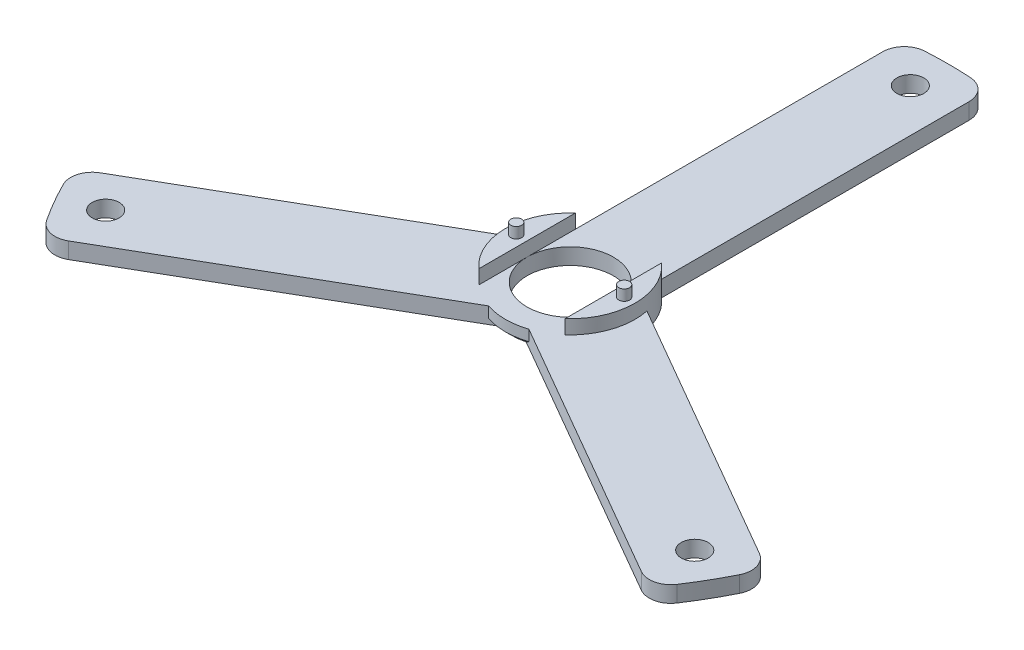
ISO-10303-21;
HEADER;
FILE_DESCRIPTION(('STEP AP214'),'2;1');
FILE_NAME('part.step','',(''),(''),'','','');
FILE_SCHEMA(('AUTOMOTIVE_DESIGN { 1 0 10303 214 1 1 1 1 }'));
ENDSEC;
DATA;
#1=APPLICATION_CONTEXT('core data for automotive mechanical design processes');
#2=APPLICATION_PROTOCOL_DEFINITION('international standard','automotive_design',2000,#1);
#3=PRODUCT_CONTEXT('',#1,'mechanical');
#4=PRODUCT('Part','Part','',(#3));
#5=PRODUCT_RELATED_PRODUCT_CATEGORY('part','',(#4));
#6=PRODUCT_DEFINITION_FORMATION('','',#4);
#7=PRODUCT_DEFINITION_CONTEXT('part definition',#1,'design');
#8=PRODUCT_DEFINITION('design','',#6,#7);
#9=PRODUCT_DEFINITION_SHAPE('','',#8);
#10=(LENGTH_UNIT() NAMED_UNIT(*) SI_UNIT(.MILLI.,.METRE.));
#11=(NAMED_UNIT(*) PLANE_ANGLE_UNIT() SI_UNIT($,.RADIAN.));
#12=(NAMED_UNIT(*) SI_UNIT($,.STERADIAN.) SOLID_ANGLE_UNIT());
#13=UNCERTAINTY_MEASURE_WITH_UNIT(LENGTH_MEASURE(1.E-05),#10,'distance_accuracy_value','');
#14=(GEOMETRIC_REPRESENTATION_CONTEXT(3) GLOBAL_UNCERTAINTY_ASSIGNED_CONTEXT((#13)) GLOBAL_UNIT_ASSIGNED_CONTEXT((#10,
#11,#12)) REPRESENTATION_CONTEXT('',''));
#15=CARTESIAN_POINT('',(0.,0.,0.));
#16=DIRECTION('',(0.,0.,1.));
#17=DIRECTION('',(1.,0.,0.));
#18=AXIS2_PLACEMENT_3D('',#15,#16,#17);
#19=CARTESIAN_POINT('',(0.,1.5,0.));
#20=DIRECTION('',(0.,1.,0.));
#21=DIRECTION('',(0.,0.,1.));
#22=AXIS2_PLACEMENT_3D('',#19,#20,#21);
#23=PLANE('',#22);
#24=CARTESIAN_POINT('',(0.,1.5,0.));
#25=DIRECTION('',(0.,1.,0.));
#26=DIRECTION('',(0.,0.,1.));
#27=AXIS2_PLACEMENT_3D('',#24,#25,#26);
#28=CIRCLE('',#27,4.);
#29=CARTESIAN_POINT('',(4.,1.5,0.));
#30=VERTEX_POINT('',#29);
#31=CARTESIAN_POINT('',(-4.,1.5,0.));
#32=VERTEX_POINT('',#31);
#33=EDGE_CURVE('E208',#30,#32,#28,.T.);
#34=ORIENTED_EDGE('',*,*,#33,.F.);
#35=DIRECTION('',(0.,0.,1.));
#36=VECTOR('',#35,1.);
#37=CARTESIAN_POINT('',(4.,1.5,-4.47213595499958));
#38=LINE('',#37,#36);
#39=CARTESIAN_POINT('',(4.,1.5,-4.47213595499958));
#40=VERTEX_POINT('',#39);
#41=EDGE_CURVE('E217',#40,#30,#38,.T.);
#42=ORIENTED_EDGE('',*,*,#41,.F.);
#43=DIRECTION('',(0.,0.,-1.));
#44=VECTOR('',#43,1.);
#45=CARTESIAN_POINT('',(4.,1.5,-4.47213595499958));
#46=LINE('',#45,#44);
#47=CARTESIAN_POINT('',(4.,1.5,-32.9393381840012));
#48=VERTEX_POINT('',#47);
#49=EDGE_CURVE('E306',#40,#48,#46,.T.);
#50=ORIENTED_EDGE('',*,*,#49,.T.);
#51=CARTESIAN_POINT('',(2.,1.5,-32.9393381840012));
#52=DIRECTION('',(0.,1.,0.));
#53=DIRECTION('',(0.,0.,1.));
#54=AXIS2_PLACEMENT_3D('',#51,#52,#53);
#55=CIRCLE('',#54,2.);
#56=CARTESIAN_POINT('',(2.12121212121212,1.5,-34.9356617103043));
#57=VERTEX_POINT('',#56);
#58=EDGE_CURVE('E407',#48,#57,#55,.T.);
#59=ORIENTED_EDGE('',*,*,#58,.T.);
#60=CARTESIAN_POINT('',(0.,1.5,0.));
#61=DIRECTION('',(0.,1.,0.));
#62=DIRECTION('',(0.,0.,1.));
#63=AXIS2_PLACEMENT_3D('',#60,#61,#62);
#64=CIRCLE('',#63,35.);
#65=CARTESIAN_POINT('',(-2.12121212121212,1.5,-34.9356617103043));
#66=VERTEX_POINT('',#65);
#67=EDGE_CURVE('E312',#57,#66,#64,.T.);
#68=ORIENTED_EDGE('',*,*,#67,.T.);
#69=CARTESIAN_POINT('',(-2.,1.5,-32.9393381840012));
#70=DIRECTION('',(0.,1.,0.));
#71=DIRECTION('',(0.,0.,1.));
#72=AXIS2_PLACEMENT_3D('',#69,#70,#71);
#73=CIRCLE('',#72,2.);
#74=CARTESIAN_POINT('',(-4.,1.5,-32.9393381840012));
#75=VERTEX_POINT('',#74);
#76=EDGE_CURVE('E413',#66,#75,#73,.T.);
#77=ORIENTED_EDGE('',*,*,#76,.T.);
#78=DIRECTION('',(0.,0.,1.));
#79=VECTOR('',#78,1.);
#80=CARTESIAN_POINT('',(-4.,1.5,-4.47213595499958));
#81=LINE('',#80,#79);
#82=CARTESIAN_POINT('',(-4.,1.5,-4.47213595499958));
#83=VERTEX_POINT('',#82);
#84=EDGE_CURVE('E317',#75,#83,#81,.T.);
#85=ORIENTED_EDGE('',*,*,#84,.T.);
#86=DIRECTION('',(0.,0.,-1.));
#87=VECTOR('',#86,1.);
#88=CARTESIAN_POINT('',(-4.,1.5,-4.47213595499958));
#89=LINE('',#88,#87);
#90=EDGE_CURVE('E222',#32,#83,#89,.T.);
#91=ORIENTED_EDGE('',*,*,#90,.F.);
#92=EDGE_LOOP('',(#34,#42,#50,#59,#68,#77,#85,#91));
#93=FACE_BOUND('',#92,.T.);
#94=CARTESIAN_POINT('',(0.,1.500012,-31.5));
#95=DIRECTION('',(0.,1.,0.));
#96=DIRECTION('',(0.,0.,1.));
#97=AXIS2_PLACEMENT_3D('',#94,#95,#96);
#98=CIRCLE('',#97,1.25);
#99=CARTESIAN_POINT('',(0.,1.500012,-30.25));
#100=VERTEX_POINT('',#99);
#101=EDGE_CURVE('E252',#100,#100,#98,.T.);
#102=ORIENTED_EDGE('',*,*,#101,.F.);
#103=EDGE_LOOP('',(#102));
#104=FACE_BOUND('',#103,.T.);
#105=ADVANCED_FACE('F43',(#93,#104),#23,.T.);
#106=CARTESIAN_POINT('',(0.,1.5,0.));
#107=DIRECTION('',(0.,-1.,0.));
#108=DIRECTION('',(0.,0.,-1.));
#109=AXIS2_PLACEMENT_3D('',#106,#107,#108);
#110=CYLINDRICAL_SURFACE('',#109,6.);
#111=CARTESIAN_POINT('',(0.,0.,0.));
#112=DIRECTION('',(0.,1.,0.));
#113=DIRECTION('',(0.,0.,1.));
#114=AXIS2_PLACEMENT_3D('',#111,#112,#113);
#115=CIRCLE('',#114,6.);
#116=CARTESIAN_POINT('',(5.87298334620742,0.,-1.22803363763797));
#117=VERTEX_POINT('',#116);
#118=CARTESIAN_POINT('',(4.,0.,-4.47213595499958));
#119=VERTEX_POINT('',#118);
#120=EDGE_CURVE('E253',#117,#119,#115,.T.);
#121=ORIENTED_EDGE('',*,*,#120,.T.);
#122=DIRECTION('',(0.,-1.,0.));
#123=VECTOR('',#122,1.);
#124=CARTESIAN_POINT('',(4.,1.5,-4.47213595499958));
#125=LINE('',#124,#123);
#126=EDGE_CURVE('E378',#40,#119,#125,.T.);
#127=ORIENTED_EDGE('',*,*,#126,.F.);
#128=DIRECTION('',(0.,-1.,0.));
#129=VECTOR('',#128,1.);
#130=CARTESIAN_POINT('',(4.,2.8,-4.47213595499958));
#131=LINE('',#130,#129);
#132=CARTESIAN_POINT('',(4.,2.8,-4.47213595499958));
#133=VERTEX_POINT('',#132);
#134=EDGE_CURVE('E236',#133,#40,#131,.T.);
#135=ORIENTED_EDGE('',*,*,#134,.F.);
#136=CARTESIAN_POINT('',(0.,2.8,0.));
#137=DIRECTION('',(0.,1.,0.));
#138=DIRECTION('',(0.,0.,1.));
#139=AXIS2_PLACEMENT_3D('',#136,#137,#138);
#140=CIRCLE('',#139,6.);
#141=CARTESIAN_POINT('',(4.,2.8,4.47213595499958));
#142=VERTEX_POINT('',#141);
#143=EDGE_CURVE('E231',#142,#133,#140,.T.);
#144=ORIENTED_EDGE('',*,*,#143,.F.);
#145=DIRECTION('',(0.,-1.,0.));
#146=VECTOR('',#145,1.);
#147=CARTESIAN_POINT('',(4.,2.8,4.47213595499958));
#148=LINE('',#147,#146);
#149=CARTESIAN_POINT('',(4.,1.5,4.47213595499958));
#150=VERTEX_POINT('',#149);
#151=EDGE_CURVE('E243',#142,#150,#148,.T.);
#152=ORIENTED_EDGE('',*,*,#151,.T.);
#153=CARTESIAN_POINT('',(0.,1.5,0.));
#154=DIRECTION('',(0.,1.,0.));
#155=DIRECTION('',(0.,0.,1.));
#156=AXIS2_PLACEMENT_3D('',#153,#154,#155);
#157=CIRCLE('',#156,6.);
#158=CARTESIAN_POINT('',(5.87298334620742,1.5,-1.22803363763797));
#159=VERTEX_POINT('',#158);
#160=EDGE_CURVE('E227',#150,#159,#157,.T.);
#161=ORIENTED_EDGE('',*,*,#160,.T.);
#162=DIRECTION('',(0.,-1.,0.));
#163=VECTOR('',#162,1.);
#164=CARTESIAN_POINT('',(5.87298334620742,1.5,-1.22803363763797));
#165=LINE('',#164,#163);
#166=EDGE_CURVE('E337',#159,#117,#165,.T.);
#167=ORIENTED_EDGE('',*,*,#166,.T.);
#168=EDGE_LOOP('',(#121,#127,#135,#144,#152,#161,#167));
#169=FACE_BOUND('',#168,.T.);
#170=ADVANCED_FACE('F467',(#169),#110,.T.);
#171=CARTESIAN_POINT('',(4.,1.5,-4.47213595499958));
#172=DIRECTION('',(-1.,0.,0.));
#173=DIRECTION('',(0.,0.,1.));
#174=AXIS2_PLACEMENT_3D('',#171,#172,#173);
#175=PLANE('',#174);
#176=DIRECTION('',(0.,0.,-1.));
#177=VECTOR('',#176,1.);
#178=CARTESIAN_POINT('',(4.,0.,-4.47213595499958));
#179=LINE('',#178,#177);
#180=CARTESIAN_POINT('',(4.,0.,-32.9393381840012));
#181=VERTEX_POINT('',#180);
#182=EDGE_CURVE('E345',#119,#181,#179,.T.);
#183=ORIENTED_EDGE('',*,*,#182,.T.);
#184=DIRECTION('',(0.,-1.,0.));
#185=VECTOR('',#184,1.);
#186=CARTESIAN_POINT('',(4.,1.5,-32.9393381840012));
#187=LINE('',#186,#185);
#188=EDGE_CURVE('E411',#181,#48,#187,.F.);
#189=ORIENTED_EDGE('',*,*,#188,.T.);
#190=ORIENTED_EDGE('',*,*,#49,.F.);
#191=ORIENTED_EDGE('',*,*,#126,.T.);
#192=EDGE_LOOP('',(#183,#189,#190,#191));
#193=FACE_BOUND('',#192,.T.);
#194=ADVANCED_FACE('F475',(#193),#175,.F.);
#195=CARTESIAN_POINT('',(0.,1.5,0.));
#196=DIRECTION('',(0.,-1.,0.));
#197=DIRECTION('',(0.,0.,-1.));
#198=AXIS2_PLACEMENT_3D('',#195,#196,#197);
#199=CYLINDRICAL_SURFACE('',#198,35.);
#200=CARTESIAN_POINT('',(0.,0.,0.));
#201=DIRECTION('',(0.,1.,0.));
#202=DIRECTION('',(0.,0.,1.));
#203=AXIS2_PLACEMENT_3D('',#200,#201,#202);
#204=CIRCLE('',#203,35.);
#205=CARTESIAN_POINT('',(2.12121212121212,0.,-34.9356617103043));
#206=VERTEX_POINT('',#205);
#207=CARTESIAN_POINT('',(-2.12121212121212,0.,-34.9356617103043));
#208=VERTEX_POINT('',#207);
#209=EDGE_CURVE('E344',#206,#208,#204,.T.);
#210=ORIENTED_EDGE('',*,*,#209,.T.);
#211=DIRECTION('',(0.,-1.,0.));
#212=VECTOR('',#211,1.);
#213=CARTESIAN_POINT('',(-2.12121212121212,1.5,-34.9356617103043));
#214=LINE('',#213,#212);
#215=EDGE_CURVE('E397',#208,#66,#214,.F.);
#216=ORIENTED_EDGE('',*,*,#215,.T.);
#217=ORIENTED_EDGE('',*,*,#67,.F.);
#218=DIRECTION('',(0.,-1.,0.));
#219=VECTOR('',#218,1.);
#220=CARTESIAN_POINT('',(2.12121212121212,1.5,-34.9356617103043));
#221=LINE('',#220,#219);
#222=EDGE_CURVE('E398',#57,#206,#221,.T.);
#223=ORIENTED_EDGE('',*,*,#222,.T.);
#224=EDGE_LOOP('',(#210,#216,#217,#223));
#225=FACE_BOUND('',#224,.T.);
#226=ADVANCED_FACE('F477',(#225),#199,.T.);
#227=CARTESIAN_POINT('',(-4.,1.5,-4.47213595499958));
#228=DIRECTION('',(1.,0.,0.));
#229=DIRECTION('',(0.,0.,-1.));
#230=AXIS2_PLACEMENT_3D('',#227,#228,#229);
#231=PLANE('',#230);
#232=ORIENTED_EDGE('',*,*,#84,.F.);
#233=DIRECTION('',(0.,-1.,0.));
#234=VECTOR('',#233,1.);
#235=CARTESIAN_POINT('',(-4.,1.5,-32.9393381840012));
#236=LINE('',#235,#234);
#237=CARTESIAN_POINT('',(-4.,0.,-32.9393381840012));
#238=VERTEX_POINT('',#237);
#239=EDGE_CURVE('E381',#75,#238,#236,.T.);
#240=ORIENTED_EDGE('',*,*,#239,.T.);
#241=DIRECTION('',(0.,0.,1.));
#242=VECTOR('',#241,1.);
#243=CARTESIAN_POINT('',(-4.,0.,-4.47213595499958));
#244=LINE('',#243,#242);
#245=CARTESIAN_POINT('',(-4.,0.,-4.47213595499958));
#246=VERTEX_POINT('',#245);
#247=EDGE_CURVE('E346',#238,#246,#244,.T.);
#248=ORIENTED_EDGE('',*,*,#247,.T.);
#249=DIRECTION('',(0.,-1.,0.));
#250=VECTOR('',#249,1.);
#251=CARTESIAN_POINT('',(-4.,1.5,-4.47213595499958));
#252=LINE('',#251,#250);
#253=EDGE_CURVE('E374',#83,#246,#252,.T.);
#254=ORIENTED_EDGE('',*,*,#253,.F.);
#255=EDGE_LOOP('',(#232,#240,#248,#254));
#256=FACE_BOUND('',#255,.T.);
#257=ADVANCED_FACE('F630',(#256),#231,.F.);
#258=CARTESIAN_POINT('',(0.,1.5,0.));
#259=DIRECTION('',(0.,-1.,0.));
#260=DIRECTION('',(0.,0.,-1.));
#261=AXIS2_PLACEMENT_3D('',#258,#259,#260);
#262=CYLINDRICAL_SURFACE('',#261,6.);
#263=CARTESIAN_POINT('',(0.,0.,0.));
#264=DIRECTION('',(0.,1.,0.));
#265=DIRECTION('',(0.,0.,1.));
#266=AXIS2_PLACEMENT_3D('',#263,#264,#265);
#267=CIRCLE('',#266,6.);
#268=CARTESIAN_POINT('',(-5.87298334620742,0.,-1.22803363763796));
#269=VERTEX_POINT('',#268);
#270=EDGE_CURVE('E348',#246,#269,#267,.T.);
#271=ORIENTED_EDGE('',*,*,#270,.T.);
#272=DIRECTION('',(0.,-1.,0.));
#273=VECTOR('',#272,1.);
#274=CARTESIAN_POINT('',(-5.87298334620742,1.5,-1.22803363763796));
#275=LINE('',#274,#273);
#276=CARTESIAN_POINT('',(-5.87298334620742,1.5,-1.22803363763796));
#277=VERTEX_POINT('',#276);
#278=EDGE_CURVE('E375',#277,#269,#275,.T.);
#279=ORIENTED_EDGE('',*,*,#278,.F.);
#280=CARTESIAN_POINT('',(0.,1.5,0.));
#281=DIRECTION('',(0.,1.,0.));
#282=DIRECTION('',(0.,0.,1.));
#283=AXIS2_PLACEMENT_3D('',#280,#281,#282);
#284=CIRCLE('',#283,6.);
#285=CARTESIAN_POINT('',(-4.,1.5,4.47213595499958));
#286=VERTEX_POINT('',#285);
#287=EDGE_CURVE('E432',#277,#286,#284,.T.);
#288=ORIENTED_EDGE('',*,*,#287,.T.);
#289=DIRECTION('',(0.,-1.,0.));
#290=VECTOR('',#289,1.);
#291=CARTESIAN_POINT('',(-4.,2.8,4.47213595499958));
#292=LINE('',#291,#290);
#293=CARTESIAN_POINT('',(-4.,2.8,4.47213595499958));
#294=VERTEX_POINT('',#293);
#295=EDGE_CURVE('E261',#294,#286,#292,.T.);
#296=ORIENTED_EDGE('',*,*,#295,.F.);
#297=CARTESIAN_POINT('',(0.,2.8,0.));
#298=DIRECTION('',(0.,1.,0.));
#299=DIRECTION('',(0.,0.,1.));
#300=AXIS2_PLACEMENT_3D('',#297,#298,#299);
#301=CIRCLE('',#300,6.);
#302=CARTESIAN_POINT('',(-4.,2.8,-4.47213595499958));
#303=VERTEX_POINT('',#302);
#304=EDGE_CURVE('E553',#303,#294,#301,.T.);
#305=ORIENTED_EDGE('',*,*,#304,.F.);
#306=DIRECTION('',(0.,-1.,0.));
#307=VECTOR('',#306,1.);
#308=CARTESIAN_POINT('',(-4.,2.8,-4.47213595499958));
#309=LINE('',#308,#307);
#310=EDGE_CURVE('E548',#303,#83,#309,.T.);
#311=ORIENTED_EDGE('',*,*,#310,.T.);
#312=ORIENTED_EDGE('',*,*,#253,.T.);
#313=EDGE_LOOP('',(#271,#279,#288,#296,#305,#311,#312));
#314=FACE_BOUND('',#313,.T.);
#315=ADVANCED_FACE('F635',(#314),#262,.T.);
#316=CARTESIAN_POINT('',(-5.87298334620742,1.5,-1.22803363763796));
#317=DIRECTION('',(0.5,0.,0.866025403784438));
#318=DIRECTION('',(0.866025403784438,0.,-0.5));
#319=AXIS2_PLACEMENT_3D('',#316,#317,#318);
#320=PLANE('',#319);
#321=DIRECTION('',(-0.866025403784438,0.,0.5));
#322=VECTOR('',#321,1.);
#323=CARTESIAN_POINT('',(-5.87298334620742,0.,-1.22803363763796));
#324=LINE('',#323,#322);
#325=CARTESIAN_POINT('',(-30.5263036511918,0.,13.0055674768629));
#326=VERTEX_POINT('',#325);
#327=EDGE_CURVE('E355',#269,#326,#324,.T.);
#328=ORIENTED_EDGE('',*,*,#327,.T.);
#329=DIRECTION('',(0.,-1.,0.));
#330=VECTOR('',#329,1.);
#331=CARTESIAN_POINT('',(-30.5263036511918,1.5,13.0055674768629));
#332=LINE('',#331,#330);
#333=CARTESIAN_POINT('',(-30.5263036511918,1.5,13.0055674768629));
#334=VERTEX_POINT('',#333);
#335=EDGE_CURVE('E429',#326,#334,#332,.F.);
#336=ORIENTED_EDGE('',*,*,#335,.T.);
#337=DIRECTION('',(-0.866025403784438,0.,0.5));
#338=VECTOR('',#337,1.);
#339=CARTESIAN_POINT('',(-5.87298334620742,1.5,-1.22803363763796));
#340=LINE('',#339,#338);
#341=EDGE_CURVE('E321',#277,#334,#340,.T.);
#342=ORIENTED_EDGE('',*,*,#341,.F.);
#343=ORIENTED_EDGE('',*,*,#278,.T.);
#344=EDGE_LOOP('',(#328,#336,#342,#343));
#345=FACE_BOUND('',#344,.T.);
#346=ADVANCED_FACE('F636',(#345),#320,.F.);
#347=CARTESIAN_POINT('',(0.,1.5,0.));
#348=DIRECTION('',(0.,-1.,0.));
#349=DIRECTION('',(0.,0.,-1.));
#350=AXIS2_PLACEMENT_3D('',#347,#348,#349);
#351=CYLINDRICAL_SURFACE('',#350,35.);
#352=CARTESIAN_POINT('',(0.,1.5,0.));
#353=DIRECTION('',(0.,1.,0.));
#354=DIRECTION('',(0.,0.,1.));
#355=AXIS2_PLACEMENT_3D('',#352,#353,#354);
#356=CIRCLE('',#355,35.);
#357=CARTESIAN_POINT('',(-31.3157765997489,1.5,15.630807271367));
#358=VERTEX_POINT('',#357);
#359=CARTESIAN_POINT('',(-29.1945644785368,1.5,19.3048544389373));
#360=VERTEX_POINT('',#359);
#361=EDGE_CURVE('E322',#358,#360,#356,.T.);
#362=ORIENTED_EDGE('',*,*,#361,.F.);
#363=DIRECTION('',(0.,-1.,0.));
#364=VECTOR('',#363,1.);
#365=CARTESIAN_POINT('',(-31.3157765997489,1.5,15.630807271367));
#366=LINE('',#365,#364);
#367=CARTESIAN_POINT('',(-31.3157765997489,0.,15.630807271367));
#368=VERTEX_POINT('',#367);
#369=EDGE_CURVE('E430',#358,#368,#366,.T.);
#370=ORIENTED_EDGE('',*,*,#369,.T.);
#371=CARTESIAN_POINT('',(0.,0.,0.));
#372=DIRECTION('',(0.,1.,0.));
#373=DIRECTION('',(0.,0.,1.));
#374=AXIS2_PLACEMENT_3D('',#371,#372,#373);
#375=CIRCLE('',#374,35.);
#376=CARTESIAN_POINT('',(-29.1945644785368,0.,19.3048544389373));
#377=VERTEX_POINT('',#376);
#378=EDGE_CURVE('E354',#368,#377,#375,.T.);
#379=ORIENTED_EDGE('',*,*,#378,.T.);
#380=DIRECTION('',(0.,-1.,0.));
#381=VECTOR('',#380,1.);
#382=CARTESIAN_POINT('',(-29.1945644785368,1.5,19.3048544389373));
#383=LINE('',#382,#381);
#384=EDGE_CURVE('E422',#377,#360,#383,.F.);
#385=ORIENTED_EDGE('',*,*,#384,.T.);
#386=EDGE_LOOP('',(#362,#370,#379,#385));
#387=FACE_BOUND('',#386,.T.);
#388=ADVANCED_FACE('F644',(#387),#351,.T.);
#389=CARTESIAN_POINT('',(-1.87298334620742,1.5,5.70016959263755));
#390=DIRECTION('',(-0.5,0.,-0.866025403784438));
#391=DIRECTION('',(-0.866025403784439,0.,0.5));
#392=AXIS2_PLACEMENT_3D('',#389,#390,#391);
#393=PLANE('',#392);
#394=DIRECTION('',(0.866025403784438,0.,-0.5));
#395=VECTOR('',#394,1.);
#396=CARTESIAN_POINT('',(-1.87298334620742,1.5,5.70016959263755));
#397=LINE('',#396,#395);
#398=CARTESIAN_POINT('',(-26.5263036511918,1.5,19.9337707071384));
#399=VERTEX_POINT('',#398);
#400=CARTESIAN_POINT('',(-1.87298334620742,1.5,5.70016959263755));
#401=VERTEX_POINT('',#400);
#402=EDGE_CURVE('E330',#399,#401,#397,.T.);
#403=ORIENTED_EDGE('',*,*,#402,.F.);
#404=DIRECTION('',(0.,-1.,0.));
#405=VECTOR('',#404,1.);
#406=CARTESIAN_POINT('',(-26.5263036511918,1.5,19.9337707071384));
#407=LINE('',#406,#405);
#408=CARTESIAN_POINT('',(-26.5263036511918,0.,19.9337707071384));
#409=VERTEX_POINT('',#408);
#410=EDGE_CURVE('E435',#399,#409,#407,.T.);
#411=ORIENTED_EDGE('',*,*,#410,.T.);
#412=DIRECTION('',(0.866025403784438,0.,-0.5));
#413=VECTOR('',#412,1.);
#414=CARTESIAN_POINT('',(-1.87298334620742,0.,5.70016959263755));
#415=LINE('',#414,#413);
#416=CARTESIAN_POINT('',(-1.26917420765551,0.,5.35156022395545));
#417=VERTEX_POINT('',#416);
#418=EDGE_CURVE('E75',#409,#417,#415,.T.);
#419=ORIENTED_EDGE('',*,*,#418,.T.);
#420=CARTESIAN_POINT('',(-1.26917420765551,0.,5.35156022395545));
#421=CARTESIAN_POINT('',(-1.32023093413752,0.0404653380983515,5.38103783873378));
#422=CARTESIAN_POINT('',(-1.37108575533407,0.0812690293954001,5.41039888344119));
#423=CARTESIAN_POINT('',(-1.47241378488301,0.163491881254017,5.46890064857773));
#424=CARTESIAN_POINT('',(-1.52288702890993,0.204910983178352,5.49804138960354));
#425=CARTESIAN_POINT('',(-1.62348314079663,0.288310590280499,5.55612058188076));
#426=CARTESIAN_POINT('',(-1.67360601295885,0.330291088546074,5.58505903561618));
#427=CARTESIAN_POINT('',(-1.77353070440246,0.414770017230821,5.64275058311984));
#428=CARTESIAN_POINT('',(-1.82333249284411,0.457268496300912,5.67150365908275));
#429=CARTESIAN_POINT('',(-1.87298334620746,0.499999999999934,5.70016959263757));
#430=B_SPLINE_CURVE_WITH_KNOTS('',3,(#420,#421,#422,#423,#424,#425,#426,#427,#428,#429),
.UNSPECIFIED.,.F.,.F.,(4,2,2,2,4),(0.,0.214516893921972,0.429013477788142,0.64350742307542,
0.858021672203616),.UNSPECIFIED.);
#431=CARTESIAN_POINT('',(-1.87298334620742,0.500000000000003,5.70016959263755));
#432=VERTEX_POINT('',#431);
#433=EDGE_CURVE('E11',#417,#432,#430,.T.);
#434=ORIENTED_EDGE('',*,*,#433,.T.);
#435=DIRECTION('',(0.,-1.,0.));
#436=VECTOR('',#435,1.);
#437=CARTESIAN_POINT('',(-1.87298334620742,1.5,5.70016959263755));
#438=LINE('',#437,#436);
#439=EDGE_CURVE('E369',#401,#432,#438,.T.);
#440=ORIENTED_EDGE('',*,*,#439,.F.);
#441=EDGE_LOOP('',(#403,#411,#419,#434,#440));
#442=FACE_BOUND('',#441,.T.);
#443=ADVANCED_FACE('F520',(#442),#393,.F.);
#444=CARTESIAN_POINT('',(0.,1.5,0.));
#445=DIRECTION('',(0.,-1.,0.));
#446=DIRECTION('',(0.,0.,-1.));
#447=AXIS2_PLACEMENT_3D('',#444,#445,#446);
#448=CYLINDRICAL_SURFACE('',#447,6.);
#449=ORIENTED_EDGE('',*,*,#439,.T.);
#450=CARTESIAN_POINT('',(0.,0.500000000000003,0.));
#451=DIRECTION('',(0.,1.,0.));
#452=DIRECTION('',(0.,0.,1.));
#453=AXIS2_PLACEMENT_3D('',#450,#451,#452);
#454=CIRCLE('',#453,6.);
#455=CARTESIAN_POINT('',(1.87298334620742,0.500000000000003,5.70016959263755));
#456=VERTEX_POINT('',#455);
#457=EDGE_CURVE('E566',#432,#456,#454,.T.);
#458=ORIENTED_EDGE('',*,*,#457,.T.);
#459=DIRECTION('',(0.,-1.,0.));
#460=VECTOR('',#459,1.);
#461=CARTESIAN_POINT('',(1.87298334620742,1.5,5.70016959263755));
#462=LINE('',#461,#460);
#463=CARTESIAN_POINT('',(1.87298334620742,1.5,5.70016959263755));
#464=VERTEX_POINT('',#463);
#465=EDGE_CURVE('E368',#464,#456,#462,.T.);
#466=ORIENTED_EDGE('',*,*,#465,.F.);
#467=CARTESIAN_POINT('',(0.,1.5,0.));
#468=DIRECTION('',(0.,1.,0.));
#469=DIRECTION('',(0.,0.,1.));
#470=AXIS2_PLACEMENT_3D('',#467,#468,#469);
#471=CIRCLE('',#470,6.);
#472=EDGE_CURVE('E328',#401,#464,#471,.T.);
#473=ORIENTED_EDGE('',*,*,#472,.F.);
#474=EDGE_LOOP('',(#449,#458,#466,#473));
#475=FACE_BOUND('',#474,.T.);
#476=ADVANCED_FACE('F522',(#475),#448,.T.);
#477=CARTESIAN_POINT('',(1.87298334620742,1.5,5.70016959263755));
#478=DIRECTION('',(0.5,0.,-0.866025403784439));
#479=DIRECTION('',(-0.866025403784439,0.,-0.5));
#480=AXIS2_PLACEMENT_3D('',#477,#478,#479);
#481=PLANE('',#480);
#482=DIRECTION('',(0.866025403784439,0.,0.5));
#483=VECTOR('',#482,1.);
#484=CARTESIAN_POINT('',(1.87298334620742,0.,5.70016959263755));
#485=LINE('',#484,#483);
#486=CARTESIAN_POINT('',(1.26917420765551,0.,5.35156022395545));
#487=VERTEX_POINT('',#486);
#488=CARTESIAN_POINT('',(26.5263036511918,0.,19.9337707071383));
#489=VERTEX_POINT('',#488);
#490=EDGE_CURVE('E64',#487,#489,#485,.T.);
#491=ORIENTED_EDGE('',*,*,#490,.T.);
#492=DIRECTION('',(0.,-1.,0.));
#493=VECTOR('',#492,1.);
#494=CARTESIAN_POINT('',(26.5263036511918,1.5,19.9337707071384));
#495=LINE('',#494,#493);
#496=CARTESIAN_POINT('',(26.5263036511918,1.5,19.9337707071383));
#497=VERTEX_POINT('',#496);
#498=EDGE_CURVE('E421',#489,#497,#495,.F.);
#499=ORIENTED_EDGE('',*,*,#498,.T.);
#500=DIRECTION('',(0.866025403784439,0.,0.5));
#501=VECTOR('',#500,1.);
#502=CARTESIAN_POINT('',(1.87298334620742,1.5,5.70016959263755));
#503=LINE('',#502,#501);
#504=EDGE_CURVE('E332',#464,#497,#503,.T.);
#505=ORIENTED_EDGE('',*,*,#504,.F.);
#506=ORIENTED_EDGE('',*,*,#465,.T.);
#507=CARTESIAN_POINT('',(1.87298334620742,0.500000000000003,5.70016959263755));
#508=CARTESIAN_POINT('',(1.8233324928441,0.457268496300943,5.67150365908274));
#509=CARTESIAN_POINT('',(1.77353070440246,0.414770017230832,5.64275058311983));
#510=CARTESIAN_POINT('',(1.67360601295886,0.330291088546068,5.58505903561618));
#511=CARTESIAN_POINT('',(1.62348314079664,0.288310590280495,5.55612058188077));
#512=CARTESIAN_POINT('',(1.52288702890993,0.204910983178359,5.49804138960354));
#513=CARTESIAN_POINT('',(1.472413784883,0.163491881254034,5.46890064857772));
#514=CARTESIAN_POINT('',(1.37108575533408,0.0812690293953878,5.4103988834412));
#515=CARTESIAN_POINT('',(1.32023093413756,0.0404653380983009,5.3810378387338));
#516=CARTESIAN_POINT('',(1.2691742076556,-1.40770286099315E-13,5.3515602239555));
#517=B_SPLINE_CURVE_WITH_KNOTS('',3,(#507,#508,#509,#510,#511,#512,#513,#514,#515,#516),
.UNSPECIFIED.,.F.,.F.,(4,2,2,2,4),(0.,0.214514249128196,0.429008194415474,0.643504778281643,
0.858021672203613),.UNSPECIFIED.);
#518=EDGE_CURVE('E59',#456,#487,#517,.T.);
#519=ORIENTED_EDGE('',*,*,#518,.T.);
#520=EDGE_LOOP('',(#491,#499,#505,#506,#519));
#521=FACE_BOUND('',#520,.T.);
#522=ADVANCED_FACE('F653',(#521),#481,.F.);
#523=CARTESIAN_POINT('',(0.,1.5,0.));
#524=DIRECTION('',(0.,-1.,0.));
#525=DIRECTION('',(0.,0.,-1.));
#526=AXIS2_PLACEMENT_3D('',#523,#524,#525);
#527=CYLINDRICAL_SURFACE('',#526,35.);
#528=CARTESIAN_POINT('',(0.,0.,0.));
#529=DIRECTION('',(0.,1.,0.));
#530=DIRECTION('',(0.,0.,1.));
#531=AXIS2_PLACEMENT_3D('',#528,#529,#530);
#532=CIRCLE('',#531,35.);
#533=CARTESIAN_POINT('',(29.1945644785368,0.,19.3048544389373));
#534=VERTEX_POINT('',#533);
#535=CARTESIAN_POINT('',(31.3157765997489,0.,15.630807271367));
#536=VERTEX_POINT('',#535);
#537=EDGE_CURVE('E359',#534,#536,#532,.T.);
#538=ORIENTED_EDGE('',*,*,#537,.T.);
#539=DIRECTION('',(0.,-1.,0.));
#540=VECTOR('',#539,1.);
#541=CARTESIAN_POINT('',(31.3157765997489,1.5,15.630807271367));
#542=LINE('',#541,#540);
#543=CARTESIAN_POINT('',(31.3157765997489,1.5,15.630807271367));
#544=VERTEX_POINT('',#543);
#545=EDGE_CURVE('E423',#536,#544,#542,.F.);
#546=ORIENTED_EDGE('',*,*,#545,.T.);
#547=CARTESIAN_POINT('',(0.,1.5,0.));
#548=DIRECTION('',(0.,1.,0.));
#549=DIRECTION('',(0.,0.,1.));
#550=AXIS2_PLACEMENT_3D('',#547,#548,#549);
#551=CIRCLE('',#550,35.);
#552=CARTESIAN_POINT('',(29.1945644785368,1.5,19.3048544389373));
#553=VERTEX_POINT('',#552);
#554=EDGE_CURVE('E331',#553,#544,#551,.T.);
#555=ORIENTED_EDGE('',*,*,#554,.F.);
#556=DIRECTION('',(0.,-1.,0.));
#557=VECTOR('',#556,1.);
#558=CARTESIAN_POINT('',(29.1945644785368,1.5,19.3048544389373));
#559=LINE('',#558,#557);
#560=EDGE_CURVE('E416',#553,#534,#559,.T.);
#561=ORIENTED_EDGE('',*,*,#560,.T.);
#562=EDGE_LOOP('',(#538,#546,#555,#561));
#563=FACE_BOUND('',#562,.T.);
#564=ADVANCED_FACE('F531',(#563),#527,.T.);
#565=CARTESIAN_POINT('',(5.87298334620742,1.5,-1.22803363763797));
#566=DIRECTION('',(-0.5,0.,0.866025403784439));
#567=DIRECTION('',(0.866025403784439,0.,0.5));
#568=AXIS2_PLACEMENT_3D('',#565,#566,#567);
#569=PLANE('',#568);
#570=DIRECTION('',(-0.866025403784439,0.,-0.5));
#571=VECTOR('',#570,1.);
#572=CARTESIAN_POINT('',(5.87298334620742,1.5,-1.22803363763797));
#573=LINE('',#572,#571);
#574=CARTESIAN_POINT('',(30.5263036511918,1.5,13.0055674768628));
#575=VERTEX_POINT('',#574);
#576=EDGE_CURVE('E340',#575,#159,#573,.T.);
#577=ORIENTED_EDGE('',*,*,#576,.F.);
#578=DIRECTION('',(0.,-1.,0.));
#579=VECTOR('',#578,1.);
#580=CARTESIAN_POINT('',(30.5263036511918,1.5,13.0055674768628));
#581=LINE('',#580,#579);
#582=CARTESIAN_POINT('',(30.5263036511918,0.,13.0055674768628));
#583=VERTEX_POINT('',#582);
#584=EDGE_CURVE('E414',#575,#583,#581,.T.);
#585=ORIENTED_EDGE('',*,*,#584,.T.);
#586=DIRECTION('',(-0.866025403784439,0.,-0.5));
#587=VECTOR('',#586,1.);
#588=CARTESIAN_POINT('',(5.87298334620742,0.,-1.22803363763797));
#589=LINE('',#588,#587);
#590=EDGE_CURVE('E316',#583,#117,#589,.T.);
#591=ORIENTED_EDGE('',*,*,#590,.T.);
#592=ORIENTED_EDGE('',*,*,#166,.F.);
#593=EDGE_LOOP('',(#577,#585,#591,#592));
#594=FACE_BOUND('',#593,.T.);
#595=ADVANCED_FACE('F453',(#594),#569,.F.);
#596=EDGE_CURVE('E204',#32,#30,#28,.T.);
#597=ORIENTED_EDGE('',*,*,#596,.F.);
#598=EDGE_CURVE('E554',#286,#32,#89,.T.);
#599=ORIENTED_EDGE('',*,*,#598,.F.);
#600=ORIENTED_EDGE('',*,*,#287,.F.);
#601=ORIENTED_EDGE('',*,*,#341,.T.);
#602=CARTESIAN_POINT('',(-29.5263036511918,1.5,14.7376182844317));
#603=DIRECTION('',(0.,1.,0.));
#604=DIRECTION('',(0.,0.,1.));
#605=AXIS2_PLACEMENT_3D('',#602,#603,#604);
#606=CIRCLE('',#605,2.);
#607=EDGE_CURVE('E401',#334,#358,#606,.T.);
#608=ORIENTED_EDGE('',*,*,#607,.T.);
#609=ORIENTED_EDGE('',*,*,#361,.T.);
#610=CARTESIAN_POINT('',(-27.5263036511918,1.5,18.2017198995695));
#611=DIRECTION('',(0.,1.,0.));
#612=DIRECTION('',(0.,0.,1.));
#613=AXIS2_PLACEMENT_3D('',#610,#611,#612);
#614=CIRCLE('',#613,2.);
#615=EDGE_CURVE('E402',#360,#399,#614,.T.);
#616=ORIENTED_EDGE('',*,*,#615,.T.);
#617=ORIENTED_EDGE('',*,*,#402,.T.);
#618=ORIENTED_EDGE('',*,*,#472,.T.);
#619=ORIENTED_EDGE('',*,*,#504,.T.);
#620=CARTESIAN_POINT('',(27.5263036511918,1.5,18.2017198995695));
#621=DIRECTION('',(0.,1.,0.));
#622=DIRECTION('',(0.,0.,1.));
#623=AXIS2_PLACEMENT_3D('',#620,#621,#622);
#624=CIRCLE('',#623,2.);
#625=EDGE_CURVE('E403',#497,#553,#624,.T.);
#626=ORIENTED_EDGE('',*,*,#625,.T.);
#627=ORIENTED_EDGE('',*,*,#554,.T.);
#628=CARTESIAN_POINT('',(29.5263036511918,1.5,14.7376182844317));
#629=DIRECTION('',(0.,1.,0.));
#630=DIRECTION('',(0.,0.,1.));
#631=AXIS2_PLACEMENT_3D('',#628,#629,#630);
#632=CIRCLE('',#631,2.);
#633=EDGE_CURVE('E410',#544,#575,#632,.T.);
#634=ORIENTED_EDGE('',*,*,#633,.T.);
#635=ORIENTED_EDGE('',*,*,#576,.T.);
#636=ORIENTED_EDGE('',*,*,#160,.F.);
#637=EDGE_CURVE('E223',#30,#150,#38,.T.);
#638=ORIENTED_EDGE('',*,*,#637,.F.);
#639=EDGE_LOOP('',(#597,#599,#600,#601,#608,#609,#616,#617,#618,#619,#626,#627,#634,#635,#636,#638));
#640=FACE_BOUND('',#639,.T.);
#641=CARTESIAN_POINT('',(27.2798002192098,1.500012,15.7500000000001));
#642=DIRECTION('',(0.,1.,0.));
#643=DIRECTION('',(0.,0.,1.));
#644=AXIS2_PLACEMENT_3D('',#641,#642,#643);
#645=CIRCLE('',#644,1.25);
#646=CARTESIAN_POINT('',(27.2798002192098,1.500012,17.0000000000001));
#647=VERTEX_POINT('',#646);
#648=EDGE_CURVE('E258',#647,#647,#645,.T.);
#649=ORIENTED_EDGE('',*,*,#648,.F.);
#650=EDGE_LOOP('',(#649));
#651=FACE_BOUND('',#650,.T.);
#652=CARTESIAN_POINT('',(-27.27980021921,1.500012,15.7499999999997));
#653=DIRECTION('',(0.,1.,0.));
#654=DIRECTION('',(0.,0.,1.));
#655=AXIS2_PLACEMENT_3D('',#652,#653,#654);
#656=CIRCLE('',#655,1.25);
#657=CARTESIAN_POINT('',(-27.27980021921,1.500012,16.9999999999997));
#658=VERTEX_POINT('',#657);
#659=EDGE_CURVE('E260',#658,#658,#656,.T.);
#660=ORIENTED_EDGE('',*,*,#659,.F.);
#661=EDGE_LOOP('',(#660));
#662=FACE_BOUND('',#661,.T.);
#663=ADVANCED_FACE('F228',(#640,#651,#662),#23,.T.);
#664=CARTESIAN_POINT('',(0.,0.,0.));
#665=DIRECTION('',(0.,1.,0.));
#666=DIRECTION('',(0.,0.,1.));
#667=AXIS2_PLACEMENT_3D('',#664,#665,#666);
#668=PLANE('',#667);
#669=CARTESIAN_POINT('',(0.,0.,0.));
#670=DIRECTION('',(0.,1.,0.));
#671=DIRECTION('',(0.,0.,1.));
#672=AXIS2_PLACEMENT_3D('',#669,#670,#671);
#673=CIRCLE('',#672,4.);
#674=CARTESIAN_POINT('',(0.,0.,4.));
#675=VERTEX_POINT('',#674);
#676=EDGE_CURVE('E215',#675,#675,#673,.T.);
#677=ORIENTED_EDGE('',*,*,#676,.T.);
#678=EDGE_LOOP('',(#677));
#679=FACE_BOUND('',#678,.T.);
#680=CARTESIAN_POINT('',(0.,0.,-31.5));
#681=DIRECTION('',(0.,1.,0.));
#682=DIRECTION('',(0.,0.,1.));
#683=AXIS2_PLACEMENT_3D('',#680,#681,#682);
#684=CIRCLE('',#683,1.25);
#685=CARTESIAN_POINT('',(0.,0.,-30.25));
#686=VERTEX_POINT('',#685);
#687=EDGE_CURVE('E246',#686,#686,#684,.T.);
#688=ORIENTED_EDGE('',*,*,#687,.T.);
#689=EDGE_LOOP('',(#688));
#690=FACE_BOUND('',#689,.T.);
#691=CARTESIAN_POINT('',(27.2798002192098,0.,15.7500000000001));
#692=DIRECTION('',(0.,1.,0.));
#693=DIRECTION('',(0.,0.,1.));
#694=AXIS2_PLACEMENT_3D('',#691,#692,#693);
#695=CIRCLE('',#694,1.25);
#696=CARTESIAN_POINT('',(27.2798002192098,0.,17.0000000000001));
#697=VERTEX_POINT('',#696);
#698=EDGE_CURVE('E251',#697,#697,#695,.T.);
#699=ORIENTED_EDGE('',*,*,#698,.T.);
#700=EDGE_LOOP('',(#699));
#701=FACE_BOUND('',#700,.T.);
#702=CARTESIAN_POINT('',(-27.27980021921,0.,15.7499999999997));
#703=DIRECTION('',(0.,1.,0.));
#704=DIRECTION('',(0.,0.,1.));
#705=AXIS2_PLACEMENT_3D('',#702,#703,#704);
#706=CIRCLE('',#705,1.25);
#707=CARTESIAN_POINT('',(-27.27980021921,0.,16.9999999999997));
#708=VERTEX_POINT('',#707);
#709=EDGE_CURVE('E256',#708,#708,#706,.T.);
#710=ORIENTED_EDGE('',*,*,#709,.T.);
#711=EDGE_LOOP('',(#710));
#712=FACE_BOUND('',#711,.T.);
#713=ORIENTED_EDGE('',*,*,#490,.F.);
#714=CARTESIAN_POINT('',(0.,0.,0.));
#715=DIRECTION('',(0.,1.,0.));
#716=DIRECTION('',(0.,0.,1.));
#717=AXIS2_PLACEMENT_3D('',#714,#715,#716);
#718=CIRCLE('',#717,5.50000000000001);
#719=EDGE_CURVE('E646',#487,#417,#718,.F.);
#720=ORIENTED_EDGE('',*,*,#719,.T.);
#721=ORIENTED_EDGE('',*,*,#418,.F.);
#722=CARTESIAN_POINT('',(-27.5263036511918,0.,18.2017198995695));
#723=DIRECTION('',(0.,1.,0.));
#724=DIRECTION('',(0.,0.,1.));
#725=AXIS2_PLACEMENT_3D('',#722,#723,#724);
#726=CIRCLE('',#725,2.);
#727=EDGE_CURVE('E383',#409,#377,#726,.F.);
#728=ORIENTED_EDGE('',*,*,#727,.T.);
#729=ORIENTED_EDGE('',*,*,#378,.F.);
#730=CARTESIAN_POINT('',(-29.5263036511918,0.,14.7376182844317));
#731=DIRECTION('',(0.,1.,0.));
#732=DIRECTION('',(0.,0.,1.));
#733=AXIS2_PLACEMENT_3D('',#730,#731,#732);
#734=CIRCLE('',#733,2.);
#735=EDGE_CURVE('E387',#368,#326,#734,.F.);
#736=ORIENTED_EDGE('',*,*,#735,.T.);
#737=ORIENTED_EDGE('',*,*,#327,.F.);
#738=ORIENTED_EDGE('',*,*,#270,.F.);
#739=ORIENTED_EDGE('',*,*,#247,.F.);
#740=CARTESIAN_POINT('',(-2.,0.,-32.9393381840012));
#741=DIRECTION('',(0.,1.,0.));
#742=DIRECTION('',(0.,0.,1.));
#743=AXIS2_PLACEMENT_3D('',#740,#741,#742);
#744=CIRCLE('',#743,2.);
#745=EDGE_CURVE('E392',#238,#208,#744,.F.);
#746=ORIENTED_EDGE('',*,*,#745,.T.);
#747=ORIENTED_EDGE('',*,*,#209,.F.);
#748=CARTESIAN_POINT('',(2.,0.,-32.9393381840012));
#749=DIRECTION('',(0.,1.,0.));
#750=DIRECTION('',(0.,0.,1.));
#751=AXIS2_PLACEMENT_3D('',#748,#749,#750);
#752=CIRCLE('',#751,2.);
#753=EDGE_CURVE('E395',#206,#181,#752,.F.);
#754=ORIENTED_EDGE('',*,*,#753,.T.);
#755=ORIENTED_EDGE('',*,*,#182,.F.);
#756=ORIENTED_EDGE('',*,*,#120,.F.);
#757=ORIENTED_EDGE('',*,*,#590,.F.);
#758=CARTESIAN_POINT('',(29.5263036511918,0.,14.7376182844317));
#759=DIRECTION('',(0.,1.,0.));
#760=DIRECTION('',(0.,0.,1.));
#761=AXIS2_PLACEMENT_3D('',#758,#759,#760);
#762=CIRCLE('',#761,2.);
#763=EDGE_CURVE('E388',#583,#536,#762,.F.);
#764=ORIENTED_EDGE('',*,*,#763,.T.);
#765=ORIENTED_EDGE('',*,*,#537,.F.);
#766=CARTESIAN_POINT('',(27.5263036511918,0.,18.2017198995695));
#767=DIRECTION('',(0.,1.,0.));
#768=DIRECTION('',(0.,0.,1.));
#769=AXIS2_PLACEMENT_3D('',#766,#767,#768);
#770=CIRCLE('',#769,2.);
#771=EDGE_CURVE('E389',#534,#489,#770,.F.);
#772=ORIENTED_EDGE('',*,*,#771,.T.);
#773=EDGE_LOOP('',(#713,#720,#721,#728,#729,#736,#737,#738,#739,#746,#747,#754,#755,#756,#757,
#764,#765,#772));
#774=FACE_BOUND('',#773,.T.);
#775=ADVANCED_FACE('F449',(#679,#690,#701,#712,#774),#668,.F.);
#776=CARTESIAN_POINT('',(-2.,1.5,-32.9393381840012));
#777=DIRECTION('',(0.,-1.,0.));
#778=DIRECTION('',(0.,0.,-1.));
#779=AXIS2_PLACEMENT_3D('',#776,#777,#778);
#780=CYLINDRICAL_SURFACE('',#779,2.);
#781=ORIENTED_EDGE('',*,*,#76,.F.);
#782=ORIENTED_EDGE('',*,*,#215,.F.);
#783=ORIENTED_EDGE('',*,*,#745,.F.);
#784=ORIENTED_EDGE('',*,*,#239,.F.);
#785=EDGE_LOOP('',(#781,#782,#783,#784));
#786=FACE_BOUND('',#785,.T.);
#787=ADVANCED_FACE('F484',(#786),#780,.T.);
#788=CARTESIAN_POINT('',(2.,1.5,-32.9393381840012));
#789=DIRECTION('',(0.,-1.,0.));
#790=DIRECTION('',(0.,0.,-1.));
#791=AXIS2_PLACEMENT_3D('',#788,#789,#790);
#792=CYLINDRICAL_SURFACE('',#791,2.);
#793=ORIENTED_EDGE('',*,*,#58,.F.);
#794=ORIENTED_EDGE('',*,*,#188,.F.);
#795=ORIENTED_EDGE('',*,*,#753,.F.);
#796=ORIENTED_EDGE('',*,*,#222,.F.);
#797=EDGE_LOOP('',(#793,#794,#795,#796));
#798=FACE_BOUND('',#797,.T.);
#799=ADVANCED_FACE('F488',(#798),#792,.T.);
#800=CARTESIAN_POINT('',(29.5263036511918,1.5,14.7376182844317));
#801=DIRECTION('',(0.,-1.,0.));
#802=DIRECTION('',(0.,0.,-1.));
#803=AXIS2_PLACEMENT_3D('',#800,#801,#802);
#804=CYLINDRICAL_SURFACE('',#803,2.);
#805=ORIENTED_EDGE('',*,*,#633,.F.);
#806=ORIENTED_EDGE('',*,*,#545,.F.);
#807=ORIENTED_EDGE('',*,*,#763,.F.);
#808=ORIENTED_EDGE('',*,*,#584,.F.);
#809=EDGE_LOOP('',(#805,#806,#807,#808));
#810=FACE_BOUND('',#809,.T.);
#811=ADVANCED_FACE('F495',(#810),#804,.T.);
#812=CARTESIAN_POINT('',(27.5263036511918,1.5,18.2017198995695));
#813=DIRECTION('',(0.,-1.,0.));
#814=DIRECTION('',(0.,0.,-1.));
#815=AXIS2_PLACEMENT_3D('',#812,#813,#814);
#816=CYLINDRICAL_SURFACE('',#815,2.);
#817=ORIENTED_EDGE('',*,*,#625,.F.);
#818=ORIENTED_EDGE('',*,*,#498,.F.);
#819=ORIENTED_EDGE('',*,*,#771,.F.);
#820=ORIENTED_EDGE('',*,*,#560,.F.);
#821=EDGE_LOOP('',(#817,#818,#819,#820));
#822=FACE_BOUND('',#821,.T.);
#823=ADVANCED_FACE('F497',(#822),#816,.T.);
#824=CARTESIAN_POINT('',(-29.5263036511918,1.5,14.7376182844317));
#825=DIRECTION('',(0.,-1.,0.));
#826=DIRECTION('',(0.,0.,-1.));
#827=AXIS2_PLACEMENT_3D('',#824,#825,#826);
#828=CYLINDRICAL_SURFACE('',#827,2.);
#829=ORIENTED_EDGE('',*,*,#607,.F.);
#830=ORIENTED_EDGE('',*,*,#335,.F.);
#831=ORIENTED_EDGE('',*,*,#735,.F.);
#832=ORIENTED_EDGE('',*,*,#369,.F.);
#833=EDGE_LOOP('',(#829,#830,#831,#832));
#834=FACE_BOUND('',#833,.T.);
#835=ADVANCED_FACE('F498',(#834),#828,.T.);
#836=CARTESIAN_POINT('',(-27.5263036511918,1.5,18.2017198995695));
#837=DIRECTION('',(0.,-1.,0.));
#838=DIRECTION('',(0.,0.,-1.));
#839=AXIS2_PLACEMENT_3D('',#836,#837,#838);
#840=CYLINDRICAL_SURFACE('',#839,2.);
#841=ORIENTED_EDGE('',*,*,#615,.F.);
#842=ORIENTED_EDGE('',*,*,#384,.F.);
#843=ORIENTED_EDGE('',*,*,#727,.F.);
#844=ORIENTED_EDGE('',*,*,#410,.F.);
#845=EDGE_LOOP('',(#841,#842,#843,#844));
#846=FACE_BOUND('',#845,.T.);
#847=ADVANCED_FACE('F501',(#846),#840,.T.);
#848=CARTESIAN_POINT('',(-27.27980021921,0.,15.7499999999997));
#849=DIRECTION('',(0.,1.,0.));
#850=DIRECTION('',(0.,0.,1.));
#851=AXIS2_PLACEMENT_3D('',#848,#849,#850);
#852=CYLINDRICAL_SURFACE('',#851,1.25);
#853=ORIENTED_EDGE('',*,*,#709,.F.);
#854=EDGE_LOOP('',(#853));
#855=FACE_BOUND('',#854,.T.);
#856=ORIENTED_EDGE('',*,*,#659,.T.);
#857=EDGE_LOOP('',(#856));
#858=FACE_BOUND('',#857,.T.);
#859=ADVANCED_FACE('F287',(#855,#858),#852,.F.);
#860=CARTESIAN_POINT('',(27.2798002192098,0.,15.7500000000001));
#861=DIRECTION('',(0.,1.,0.));
#862=DIRECTION('',(0.,0.,1.));
#863=AXIS2_PLACEMENT_3D('',#860,#861,#862);
#864=CYLINDRICAL_SURFACE('',#863,1.25);
#865=ORIENTED_EDGE('',*,*,#698,.F.);
#866=EDGE_LOOP('',(#865));
#867=FACE_BOUND('',#866,.T.);
#868=ORIENTED_EDGE('',*,*,#648,.T.);
#869=EDGE_LOOP('',(#868));
#870=FACE_BOUND('',#869,.T.);
#871=ADVANCED_FACE('F285',(#867,#870),#864,.F.);
#872=CARTESIAN_POINT('',(0.,0.,-31.5));
#873=DIRECTION('',(0.,1.,0.));
#874=DIRECTION('',(0.,0.,1.));
#875=AXIS2_PLACEMENT_3D('',#872,#873,#874);
#876=CYLINDRICAL_SURFACE('',#875,1.25);
#877=ORIENTED_EDGE('',*,*,#687,.F.);
#878=EDGE_LOOP('',(#877));
#879=FACE_BOUND('',#878,.T.);
#880=ORIENTED_EDGE('',*,*,#101,.T.);
#881=EDGE_LOOP('',(#880));
#882=FACE_BOUND('',#881,.T.);
#883=ADVANCED_FACE('F275',(#879,#882),#876,.F.);
#884=CARTESIAN_POINT('',(4.,2.8,-4.47213595499958));
#885=DIRECTION('',(1.,0.,0.));
#886=DIRECTION('',(0.,0.,-1.));
#887=AXIS2_PLACEMENT_3D('',#884,#885,#886);
#888=PLANE('',#887);
#889=ORIENTED_EDGE('',*,*,#41,.T.);
#890=ORIENTED_EDGE('',*,*,#637,.T.);
#891=ORIENTED_EDGE('',*,*,#151,.F.);
#892=DIRECTION('',(0.,0.,1.));
#893=VECTOR('',#892,1.);
#894=CARTESIAN_POINT('',(4.,2.8,-4.47213595499958));
#895=LINE('',#894,#893);
#896=EDGE_CURVE('E242',#133,#142,#895,.T.);
#897=ORIENTED_EDGE('',*,*,#896,.F.);
#898=ORIENTED_EDGE('',*,*,#134,.T.);
#899=EDGE_LOOP('',(#889,#890,#891,#897,#898));
#900=FACE_BOUND('',#899,.T.);
#901=ADVANCED_FACE('F237',(#900),#888,.F.);
#902=CARTESIAN_POINT('',(0.,2.8,0.));
#903=DIRECTION('',(0.,1.,0.));
#904=DIRECTION('',(0.,0.,1.));
#905=AXIS2_PLACEMENT_3D('',#902,#903,#904);
#906=PLANE('',#905);
#907=CARTESIAN_POINT('',(5.,2.8,0.));
#908=DIRECTION('',(0.,1.,0.));
#909=DIRECTION('',(0.,0.,1.));
#910=AXIS2_PLACEMENT_3D('',#907,#908,#909);
#911=CIRCLE('',#910,0.5);
#912=CARTESIAN_POINT('',(5.,2.8,0.5));
#913=VERTEX_POINT('',#912);
#914=EDGE_CURVE('E567',#913,#913,#911,.T.);
#915=ORIENTED_EDGE('',*,*,#914,.F.);
#916=EDGE_LOOP('',(#915));
#917=FACE_BOUND('',#916,.T.);
#918=ORIENTED_EDGE('',*,*,#143,.T.);
#919=ORIENTED_EDGE('',*,*,#896,.T.);
#920=EDGE_LOOP('',(#918,#919));
#921=FACE_BOUND('',#920,.T.);
#922=ADVANCED_FACE('F282',(#917,#921),#906,.T.);
#923=CARTESIAN_POINT('',(-4.,2.8,-4.47213595499958));
#924=DIRECTION('',(-1.,0.,0.));
#925=DIRECTION('',(0.,0.,1.));
#926=AXIS2_PLACEMENT_3D('',#923,#924,#925);
#927=PLANE('',#926);
#928=ORIENTED_EDGE('',*,*,#598,.T.);
#929=ORIENTED_EDGE('',*,*,#90,.T.);
#930=ORIENTED_EDGE('',*,*,#310,.F.);
#931=DIRECTION('',(0.,0.,-1.));
#932=VECTOR('',#931,1.);
#933=CARTESIAN_POINT('',(-4.,2.8,-4.47213595499958));
#934=LINE('',#933,#932);
#935=EDGE_CURVE('E555',#294,#303,#934,.T.);
#936=ORIENTED_EDGE('',*,*,#935,.F.);
#937=ORIENTED_EDGE('',*,*,#295,.T.);
#938=EDGE_LOOP('',(#928,#929,#930,#936,#937));
#939=FACE_BOUND('',#938,.T.);
#940=ADVANCED_FACE('F599',(#939),#927,.F.);
#941=CARTESIAN_POINT('',(0.,2.8,0.));
#942=DIRECTION('',(0.,1.,0.));
#943=DIRECTION('',(0.,0.,1.));
#944=AXIS2_PLACEMENT_3D('',#941,#942,#943);
#945=PLANE('',#944);
#946=CARTESIAN_POINT('',(-5.,2.8,0.));
#947=DIRECTION('',(0.,1.,0.));
#948=DIRECTION('',(0.,0.,-1.));
#949=AXIS2_PLACEMENT_3D('',#946,#947,#948);
#950=CIRCLE('',#949,0.5);
#951=CARTESIAN_POINT('',(-5.,2.8,-0.5));
#952=VERTEX_POINT('',#951);
#953=EDGE_CURVE('E556',#952,#952,#950,.T.);
#954=ORIENTED_EDGE('',*,*,#953,.F.);
#955=EDGE_LOOP('',(#954));
#956=FACE_BOUND('',#955,.T.);
#957=ORIENTED_EDGE('',*,*,#304,.T.);
#958=ORIENTED_EDGE('',*,*,#935,.T.);
#959=EDGE_LOOP('',(#957,#958));
#960=FACE_BOUND('',#959,.T.);
#961=ADVANCED_FACE('F592',(#956,#960),#945,.T.);
#962=CARTESIAN_POINT('',(-5.,3.8,0.));
#963=DIRECTION('',(0.,-1.,0.));
#964=DIRECTION('',(0.,0.,-1.));
#965=AXIS2_PLACEMENT_3D('',#962,#963,#964);
#966=CYLINDRICAL_SURFACE('',#965,0.5);
#967=CARTESIAN_POINT('',(-5.,3.8,0.));
#968=DIRECTION('',(0.,1.,0.));
#969=DIRECTION('',(0.,0.,-1.));
#970=AXIS2_PLACEMENT_3D('',#967,#968,#969);
#971=CIRCLE('',#970,0.5);
#972=CARTESIAN_POINT('',(-5.,3.8,-0.5));
#973=VERTEX_POINT('',#972);
#974=EDGE_CURVE('E224',#973,#973,#971,.T.);
#975=ORIENTED_EDGE('',*,*,#974,.F.);
#976=EDGE_LOOP('',(#975));
#977=FACE_BOUND('',#976,.T.);
#978=ORIENTED_EDGE('',*,*,#953,.T.);
#979=EDGE_LOOP('',(#978));
#980=FACE_BOUND('',#979,.T.);
#981=ADVANCED_FACE('F591',(#977,#980),#966,.T.);
#982=CARTESIAN_POINT('',(-5.,3.8,0.));
#983=DIRECTION('',(0.,-1.,0.));
#984=DIRECTION('',(0.,0.,-1.));
#985=AXIS2_PLACEMENT_3D('',#982,#983,#984);
#986=PLANE('',#985);
#987=ORIENTED_EDGE('',*,*,#974,.T.);
#988=EDGE_LOOP('',(#987));
#989=FACE_BOUND('',#988,.T.);
#990=ADVANCED_FACE('F589',(#989),#986,.F.);
#991=CARTESIAN_POINT('',(5.,3.8,0.));
#992=DIRECTION('',(0.,-1.,0.));
#993=DIRECTION('',(0.,0.,-1.));
#994=AXIS2_PLACEMENT_3D('',#991,#992,#993);
#995=CYLINDRICAL_SURFACE('',#994,0.5);
#996=CARTESIAN_POINT('',(5.,3.8,0.));
#997=DIRECTION('',(0.,1.,0.));
#998=DIRECTION('',(0.,0.,1.));
#999=AXIS2_PLACEMENT_3D('',#996,#997,#998);
#1000=CIRCLE('',#999,0.5);
#1001=CARTESIAN_POINT('',(5.,3.8,0.5));
#1002=VERTEX_POINT('',#1001);
#1003=EDGE_CURVE('E543',#1002,#1002,#1000,.T.);
#1004=ORIENTED_EDGE('',*,*,#1003,.F.);
#1005=EDGE_LOOP('',(#1004));
#1006=FACE_BOUND('',#1005,.T.);
#1007=ORIENTED_EDGE('',*,*,#914,.T.);
#1008=EDGE_LOOP('',(#1007));
#1009=FACE_BOUND('',#1008,.T.);
#1010=ADVANCED_FACE('F581',(#1006,#1009),#995,.T.);
#1011=CARTESIAN_POINT('',(5.,3.8,0.));
#1012=DIRECTION('',(0.,1.,0.));
#1013=DIRECTION('',(0.,0.,1.));
#1014=AXIS2_PLACEMENT_3D('',#1011,#1012,#1013);
#1015=PLANE('',#1014);
#1016=ORIENTED_EDGE('',*,*,#1003,.T.);
#1017=EDGE_LOOP('',(#1016));
#1018=FACE_BOUND('',#1017,.T.);
#1019=ADVANCED_FACE('F574',(#1018),#1015,.T.);
#1020=CARTESIAN_POINT('',(0.,0.,0.));
#1021=DIRECTION('',(0.,1.,0.));
#1022=DIRECTION('',(0.,0.,1.));
#1023=AXIS2_PLACEMENT_3D('',#1020,#1021,#1022);
#1024=CYLINDRICAL_SURFACE('',#1023,4.);
#1025=ORIENTED_EDGE('',*,*,#33,.T.);
#1026=ORIENTED_EDGE('',*,*,#596,.T.);
#1027=EDGE_LOOP('',(#1025,#1026));
#1028=FACE_BOUND('',#1027,.T.);
#1029=ORIENTED_EDGE('',*,*,#676,.F.);
#1030=EDGE_LOOP('',(#1029));
#1031=FACE_BOUND('',#1030,.T.);
#1032=ADVANCED_FACE('F206',(#1028,#1031),#1024,.F.);
#1033=CARTESIAN_POINT('',(0.,0.500000000000003,0.));
#1034=DIRECTION('',(0.,1.,0.));
#1035=DIRECTION('',(0.,0.,1.));
#1036=AXIS2_PLACEMENT_3D('',#1033,#1034,#1035);
#1037=CONICAL_SURFACE('',#1036,6.,0.785398163397441);
#1038=ORIENTED_EDGE('',*,*,#433,.F.);
#1039=ORIENTED_EDGE('',*,*,#719,.F.);
#1040=ORIENTED_EDGE('',*,*,#518,.F.);
#1041=ORIENTED_EDGE('',*,*,#457,.F.);
#1042=EDGE_LOOP('',(#1038,#1039,#1040,#1041));
#1043=FACE_BOUND('',#1042,.T.);
#1044=ADVANCED_FACE('F46',(#1043),#1037,.T.);
#1045=CLOSED_SHELL('',(#105,#170,#194,#226,#257,#315,#346,#388,#443,#476,#522,#564,#595,#663,
#775,#787,#799,#811,#823,#835,#847,#859,#871,#883,#901,#922,#940,#961,#981,#990,#1010,#1019,
#1032,#1044));
#1046=MANIFOLD_SOLID_BREP('B2',#1045);
#1047=ADVANCED_BREP_SHAPE_REPRESENTATION('',(#18,#1046),#14);
#1048=SHAPE_DEFINITION_REPRESENTATION(#9,#1047);
ENDSEC;
END-ISO-10303-21;
